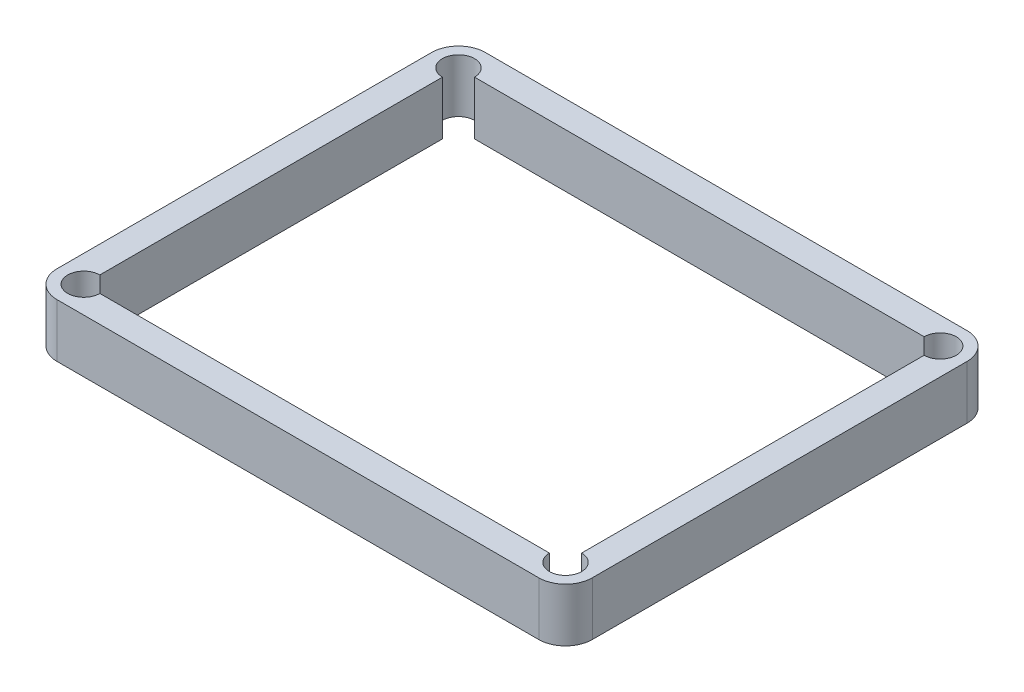
ISO-10303-21;
HEADER;
FILE_DESCRIPTION(('STEP AP214'),'2;1');
FILE_NAME('part.step','',(''),(''),'','','');
FILE_SCHEMA(('AUTOMOTIVE_DESIGN { 1 0 10303 214 1 1 1 1 }'));
ENDSEC;
DATA;
#1=APPLICATION_CONTEXT('core data for automotive mechanical design processes');
#2=APPLICATION_PROTOCOL_DEFINITION('international standard','automotive_design',2000,#1);
#3=PRODUCT_CONTEXT('',#1,'mechanical');
#4=PRODUCT('Part','Part','',(#3));
#5=PRODUCT_RELATED_PRODUCT_CATEGORY('part','',(#4));
#6=PRODUCT_DEFINITION_FORMATION('','',#4);
#7=PRODUCT_DEFINITION_CONTEXT('part definition',#1,'design');
#8=PRODUCT_DEFINITION('design','',#6,#7);
#9=PRODUCT_DEFINITION_SHAPE('','',#8);
#10=(LENGTH_UNIT() NAMED_UNIT(*) SI_UNIT(.MILLI.,.METRE.));
#11=(NAMED_UNIT(*) PLANE_ANGLE_UNIT() SI_UNIT($,.RADIAN.));
#12=(NAMED_UNIT(*) SI_UNIT($,.STERADIAN.) SOLID_ANGLE_UNIT());
#13=UNCERTAINTY_MEASURE_WITH_UNIT(LENGTH_MEASURE(1.E-05),#10,'distance_accuracy_value','');
#14=(GEOMETRIC_REPRESENTATION_CONTEXT(3) GLOBAL_UNCERTAINTY_ASSIGNED_CONTEXT((#13)) GLOBAL_UNIT_ASSIGNED_CONTEXT((#10,
#11,#12)) REPRESENTATION_CONTEXT('',''));
#15=CARTESIAN_POINT('',(0.,0.,0.));
#16=DIRECTION('',(0.,0.,1.));
#17=DIRECTION('',(1.,0.,0.));
#18=AXIS2_PLACEMENT_3D('',#15,#16,#17);
#19=CARTESIAN_POINT('',(-55.2139943562877,5.,-17.0443805869234));
#20=DIRECTION('',(0.,-1.,0.));
#21=DIRECTION('',(0.,0.,-1.));
#22=AXIS2_PLACEMENT_3D('',#19,#20,#21);
#23=CYLINDRICAL_SURFACE('',#22,2.5);
#24=CARTESIAN_POINT('',(-55.2139943562877,0.,-17.0443805869234));
#25=DIRECTION('',(0.,1.,0.));
#26=DIRECTION('',(0.,0.,1.));
#27=AXIS2_PLACEMENT_3D('',#24,#25,#26);
#28=CIRCLE('',#27,2.5);
#29=CARTESIAN_POINT('',(-55.2139943562877,0.,-19.5443805869234));
#30=VERTEX_POINT('',#29);
#31=CARTESIAN_POINT('',(-57.7139943562877,0.,-17.0443805869234));
#32=VERTEX_POINT('',#31);
#33=EDGE_CURVE('E168',#30,#32,#28,.T.);
#34=ORIENTED_EDGE('',*,*,#33,.T.);
#35=DIRECTION('',(0.,-1.,0.));
#36=VECTOR('',#35,1.);
#37=CARTESIAN_POINT('',(-57.7139943562877,5.,-17.0443805869234));
#38=LINE('',#37,#36);
#39=CARTESIAN_POINT('',(-57.7139943562877,5.,-17.0443805869234));
#40=VERTEX_POINT('',#39);
#41=EDGE_CURVE('E229',#40,#32,#38,.T.);
#42=ORIENTED_EDGE('',*,*,#41,.F.);
#43=CARTESIAN_POINT('',(-55.2139943562877,5.,-17.0443805869234));
#44=DIRECTION('',(0.,1.,0.));
#45=DIRECTION('',(0.,0.,1.));
#46=AXIS2_PLACEMENT_3D('',#43,#44,#45);
#47=CIRCLE('',#46,2.5);
#48=CARTESIAN_POINT('',(-55.2139943562877,5.,-19.5443805869234));
#49=VERTEX_POINT('',#48);
#50=EDGE_CURVE('E175',#49,#40,#47,.T.);
#51=ORIENTED_EDGE('',*,*,#50,.F.);
#52=DIRECTION('',(0.,-1.,0.));
#53=VECTOR('',#52,1.);
#54=CARTESIAN_POINT('',(-55.2139943562877,5.,-19.5443805869234));
#55=LINE('',#54,#53);
#56=EDGE_CURVE('E193',#49,#30,#55,.T.);
#57=ORIENTED_EDGE('',*,*,#56,.T.);
#58=EDGE_LOOP('',(#34,#42,#51,#57));
#59=FACE_BOUND('',#58,.T.);
#60=ADVANCED_FACE('F31',(#59),#23,.T.);
#61=CARTESIAN_POINT('',(-57.7139943562877,5.,-17.0443805869234));
#62=DIRECTION('',(1.,0.,0.));
#63=DIRECTION('',(0.,0.,-1.));
#64=AXIS2_PLACEMENT_3D('',#61,#62,#63);
#65=PLANE('',#64);
#66=DIRECTION('',(0.,0.,1.));
#67=VECTOR('',#66,1.);
#68=CARTESIAN_POINT('',(-57.7139943562877,0.,-17.0443805869234));
#69=LINE('',#68,#67);
#70=CARTESIAN_POINT('',(-57.7139943562877,0.,17.9556194130766));
#71=VERTEX_POINT('',#70);
#72=EDGE_CURVE('E196',#32,#71,#69,.T.);
#73=ORIENTED_EDGE('',*,*,#72,.T.);
#74=DIRECTION('',(0.,-1.,0.));
#75=VECTOR('',#74,1.);
#76=CARTESIAN_POINT('',(-57.7139943562877,5.,17.9556194130766));
#77=LINE('',#76,#75);
#78=CARTESIAN_POINT('',(-57.7139943562877,5.,17.9556194130766));
#79=VERTEX_POINT('',#78);
#80=EDGE_CURVE('E226',#79,#71,#77,.T.);
#81=ORIENTED_EDGE('',*,*,#80,.F.);
#82=DIRECTION('',(0.,0.,1.));
#83=VECTOR('',#82,1.);
#84=CARTESIAN_POINT('',(-57.7139943562877,5.,-17.0443805869234));
#85=LINE('',#84,#83);
#86=EDGE_CURVE('E178',#40,#79,#85,.T.);
#87=ORIENTED_EDGE('',*,*,#86,.F.);
#88=ORIENTED_EDGE('',*,*,#41,.T.);
#89=EDGE_LOOP('',(#73,#81,#87,#88));
#90=FACE_BOUND('',#89,.T.);
#91=ADVANCED_FACE('F297',(#90),#65,.F.);
#92=CARTESIAN_POINT('',(-55.2139943562877,5.,17.9556194130766));
#93=DIRECTION('',(0.,-1.,0.));
#94=DIRECTION('',(0.,0.,-1.));
#95=AXIS2_PLACEMENT_3D('',#92,#93,#94);
#96=CYLINDRICAL_SURFACE('',#95,2.5);
#97=CARTESIAN_POINT('',(-55.2139943562877,0.,17.9556194130766));
#98=DIRECTION('',(0.,1.,0.));
#99=DIRECTION('',(0.,0.,1.));
#100=AXIS2_PLACEMENT_3D('',#97,#98,#99);
#101=CIRCLE('',#100,2.5);
#102=CARTESIAN_POINT('',(-55.2139943562877,0.,20.4556194130766));
#103=VERTEX_POINT('',#102);
#104=EDGE_CURVE('E198',#71,#103,#101,.T.);
#105=ORIENTED_EDGE('',*,*,#104,.T.);
#106=DIRECTION('',(0.,-1.,0.));
#107=VECTOR('',#106,1.);
#108=CARTESIAN_POINT('',(-55.2139943562877,5.,20.4556194130766));
#109=LINE('',#108,#107);
#110=CARTESIAN_POINT('',(-55.2139943562877,5.,20.4556194130766));
#111=VERTEX_POINT('',#110);
#112=EDGE_CURVE('E223',#111,#103,#109,.T.);
#113=ORIENTED_EDGE('',*,*,#112,.F.);
#114=CARTESIAN_POINT('',(-55.2139943562877,5.,17.9556194130766));
#115=DIRECTION('',(0.,1.,0.));
#116=DIRECTION('',(0.,0.,1.));
#117=AXIS2_PLACEMENT_3D('',#114,#115,#116);
#118=CIRCLE('',#117,2.5);
#119=EDGE_CURVE('E181',#79,#111,#118,.T.);
#120=ORIENTED_EDGE('',*,*,#119,.F.);
#121=ORIENTED_EDGE('',*,*,#80,.T.);
#122=EDGE_LOOP('',(#105,#113,#120,#121));
#123=FACE_BOUND('',#122,.T.);
#124=ADVANCED_FACE('F302',(#123),#96,.T.);
#125=CARTESIAN_POINT('',(-55.2139943562877,5.,20.4556194130766));
#126=DIRECTION('',(0.,0.,-1.));
#127=DIRECTION('',(-1.,0.,0.));
#128=AXIS2_PLACEMENT_3D('',#125,#126,#127);
#129=PLANE('',#128);
#130=DIRECTION('',(1.,0.,0.));
#131=VECTOR('',#130,1.);
#132=CARTESIAN_POINT('',(-55.2139943562877,0.,20.4556194130766));
#133=LINE('',#132,#131);
#134=CARTESIAN_POINT('',(-10.2139943562877,0.,20.4556194130766));
#135=VERTEX_POINT('',#134);
#136=EDGE_CURVE('E200',#103,#135,#133,.T.);
#137=ORIENTED_EDGE('',*,*,#136,.T.);
#138=DIRECTION('',(0.,-1.,0.));
#139=VECTOR('',#138,1.);
#140=CARTESIAN_POINT('',(-10.2139943562877,5.,20.4556194130766));
#141=LINE('',#140,#139);
#142=CARTESIAN_POINT('',(-10.2139943562877,5.,20.4556194130766));
#143=VERTEX_POINT('',#142);
#144=EDGE_CURVE('E220',#143,#135,#141,.T.);
#145=ORIENTED_EDGE('',*,*,#144,.F.);
#146=DIRECTION('',(1.,0.,0.));
#147=VECTOR('',#146,1.);
#148=CARTESIAN_POINT('',(-55.2139943562877,5.,20.4556194130766));
#149=LINE('',#148,#147);
#150=EDGE_CURVE('E183',#111,#143,#149,.T.);
#151=ORIENTED_EDGE('',*,*,#150,.F.);
#152=ORIENTED_EDGE('',*,*,#112,.T.);
#153=EDGE_LOOP('',(#137,#145,#151,#152));
#154=FACE_BOUND('',#153,.T.);
#155=ADVANCED_FACE('F334',(#154),#129,.F.);
#156=CARTESIAN_POINT('',(-10.2139943562877,5.,17.9556194130766));
#157=DIRECTION('',(0.,-1.,0.));
#158=DIRECTION('',(0.,0.,-1.));
#159=AXIS2_PLACEMENT_3D('',#156,#157,#158);
#160=CYLINDRICAL_SURFACE('',#159,2.5);
#161=CARTESIAN_POINT('',(-10.2139943562877,0.,17.9556194130766));
#162=DIRECTION('',(0.,1.,0.));
#163=DIRECTION('',(0.,0.,1.));
#164=AXIS2_PLACEMENT_3D('',#161,#162,#163);
#165=CIRCLE('',#164,2.5);
#166=CARTESIAN_POINT('',(-7.71399435628767,0.,17.9556194130766));
#167=VERTEX_POINT('',#166);
#168=EDGE_CURVE('E202',#135,#167,#165,.T.);
#169=ORIENTED_EDGE('',*,*,#168,.T.);
#170=DIRECTION('',(0.,-1.,0.));
#171=VECTOR('',#170,1.);
#172=CARTESIAN_POINT('',(-7.71399435628767,5.,17.9556194130766));
#173=LINE('',#172,#171);
#174=CARTESIAN_POINT('',(-7.71399435628767,5.,17.9556194130766));
#175=VERTEX_POINT('',#174);
#176=EDGE_CURVE('E217',#175,#167,#173,.T.);
#177=ORIENTED_EDGE('',*,*,#176,.F.);
#178=CARTESIAN_POINT('',(-10.2139943562877,5.,17.9556194130766));
#179=DIRECTION('',(0.,1.,0.));
#180=DIRECTION('',(0.,0.,1.));
#181=AXIS2_PLACEMENT_3D('',#178,#179,#180);
#182=CIRCLE('',#181,2.5);
#183=EDGE_CURVE('E185',#143,#175,#182,.T.);
#184=ORIENTED_EDGE('',*,*,#183,.F.);
#185=ORIENTED_EDGE('',*,*,#144,.T.);
#186=EDGE_LOOP('',(#169,#177,#184,#185));
#187=FACE_BOUND('',#186,.T.);
#188=ADVANCED_FACE('F330',(#187),#160,.T.);
#189=CARTESIAN_POINT('',(-7.71399435628767,5.,-17.0443805869234));
#190=DIRECTION('',(-1.,0.,0.));
#191=DIRECTION('',(0.,0.,1.));
#192=AXIS2_PLACEMENT_3D('',#189,#190,#191);
#193=PLANE('',#192);
#194=DIRECTION('',(0.,0.,-1.));
#195=VECTOR('',#194,1.);
#196=CARTESIAN_POINT('',(-7.71399435628767,0.,-17.0443805869234));
#197=LINE('',#196,#195);
#198=CARTESIAN_POINT('',(-7.71399435628767,0.,-17.0443805869234));
#199=VERTEX_POINT('',#198);
#200=EDGE_CURVE('E204',#167,#199,#197,.T.);
#201=ORIENTED_EDGE('',*,*,#200,.T.);
#202=DIRECTION('',(0.,-1.,0.));
#203=VECTOR('',#202,1.);
#204=CARTESIAN_POINT('',(-7.71399435628767,5.,-17.0443805869234));
#205=LINE('',#204,#203);
#206=CARTESIAN_POINT('',(-7.71399435628767,5.,-17.0443805869234));
#207=VERTEX_POINT('',#206);
#208=EDGE_CURVE('E214',#207,#199,#205,.T.);
#209=ORIENTED_EDGE('',*,*,#208,.F.);
#210=DIRECTION('',(0.,0.,-1.));
#211=VECTOR('',#210,1.);
#212=CARTESIAN_POINT('',(-7.71399435628767,5.,-17.0443805869234));
#213=LINE('',#212,#211);
#214=EDGE_CURVE('E187',#175,#207,#213,.T.);
#215=ORIENTED_EDGE('',*,*,#214,.F.);
#216=ORIENTED_EDGE('',*,*,#176,.T.);
#217=EDGE_LOOP('',(#201,#209,#215,#216));
#218=FACE_BOUND('',#217,.T.);
#219=ADVANCED_FACE('F325',(#218),#193,.F.);
#220=CARTESIAN_POINT('',(-10.2139943562877,5.,-17.0443805869234));
#221=DIRECTION('',(0.,-1.,0.));
#222=DIRECTION('',(0.,0.,-1.));
#223=AXIS2_PLACEMENT_3D('',#220,#221,#222);
#224=CYLINDRICAL_SURFACE('',#223,2.5);
#225=CARTESIAN_POINT('',(-10.2139943562877,0.,-17.0443805869234));
#226=DIRECTION('',(0.,1.,0.));
#227=DIRECTION('',(0.,0.,1.));
#228=AXIS2_PLACEMENT_3D('',#225,#226,#227);
#229=CIRCLE('',#228,2.5);
#230=CARTESIAN_POINT('',(-10.2139943562877,0.,-19.5443805869234));
#231=VERTEX_POINT('',#230);
#232=EDGE_CURVE('E206',#199,#231,#229,.T.);
#233=ORIENTED_EDGE('',*,*,#232,.T.);
#234=DIRECTION('',(0.,-1.,0.));
#235=VECTOR('',#234,1.);
#236=CARTESIAN_POINT('',(-10.2139943562877,5.,-19.5443805869234));
#237=LINE('',#236,#235);
#238=CARTESIAN_POINT('',(-10.2139943562877,5.,-19.5443805869234));
#239=VERTEX_POINT('',#238);
#240=EDGE_CURVE('E211',#239,#231,#237,.T.);
#241=ORIENTED_EDGE('',*,*,#240,.F.);
#242=CARTESIAN_POINT('',(-10.2139943562877,5.,-17.0443805869234));
#243=DIRECTION('',(0.,1.,0.));
#244=DIRECTION('',(0.,0.,1.));
#245=AXIS2_PLACEMENT_3D('',#242,#243,#244);
#246=CIRCLE('',#245,2.5);
#247=EDGE_CURVE('E189',#207,#239,#246,.T.);
#248=ORIENTED_EDGE('',*,*,#247,.F.);
#249=ORIENTED_EDGE('',*,*,#208,.T.);
#250=EDGE_LOOP('',(#233,#241,#248,#249));
#251=FACE_BOUND('',#250,.T.);
#252=ADVANCED_FACE('F320',(#251),#224,.T.);
#253=CARTESIAN_POINT('',(-55.2139943562877,5.,-19.5443805869234));
#254=DIRECTION('',(0.,0.,1.));
#255=DIRECTION('',(1.,0.,0.));
#256=AXIS2_PLACEMENT_3D('',#253,#254,#255);
#257=PLANE('',#256);
#258=DIRECTION('',(-1.,0.,0.));
#259=VECTOR('',#258,1.);
#260=CARTESIAN_POINT('',(-55.2139943562877,0.,-19.5443805869234));
#261=LINE('',#260,#259);
#262=EDGE_CURVE('E179',#231,#30,#261,.T.);
#263=ORIENTED_EDGE('',*,*,#262,.T.);
#264=ORIENTED_EDGE('',*,*,#56,.F.);
#265=DIRECTION('',(-1.,0.,0.));
#266=VECTOR('',#265,1.);
#267=CARTESIAN_POINT('',(-55.2139943562877,5.,-19.5443805869234));
#268=LINE('',#267,#266);
#269=EDGE_CURVE('E191',#239,#49,#268,.T.);
#270=ORIENTED_EDGE('',*,*,#269,.F.);
#271=ORIENTED_EDGE('',*,*,#240,.T.);
#272=EDGE_LOOP('',(#263,#264,#270,#271));
#273=FACE_BOUND('',#272,.T.);
#274=ADVANCED_FACE('F318',(#273),#257,.F.);
#275=CARTESIAN_POINT('',(-55.2139943562877,5.,-17.0443805869234));
#276=DIRECTION('',(0.,1.,0.));
#277=DIRECTION('',(0.,0.,1.));
#278=AXIS2_PLACEMENT_3D('',#275,#276,#277);
#279=PLANE('',#278);
#280=DIRECTION('',(0.,0.,1.));
#281=VECTOR('',#280,1.);
#282=CARTESIAN_POINT('',(-55.2139943562876,5.,-17.0443805869234));
#283=LINE('',#282,#281);
#284=CARTESIAN_POINT('',(-55.2139943562876,5.,-15.5443805869234));
#285=VERTEX_POINT('',#284);
#286=CARTESIAN_POINT('',(-55.2139943562876,5.,16.4556194130766));
#287=VERTEX_POINT('',#286);
#288=EDGE_CURVE('E52',#285,#287,#283,.T.);
#289=ORIENTED_EDGE('',*,*,#288,.F.);
#290=CARTESIAN_POINT('',(-55.2139943562876,5.,-17.0443805869234));
#291=DIRECTION('',(0.,1.,0.));
#292=DIRECTION('',(0.,0.,1.));
#293=AXIS2_PLACEMENT_3D('',#290,#291,#292);
#294=CIRCLE('',#293,1.5);
#295=CARTESIAN_POINT('',(-53.7139943562876,5.,-17.0443805869234));
#296=VERTEX_POINT('',#295);
#297=EDGE_CURVE('E157',#296,#285,#294,.T.);
#298=ORIENTED_EDGE('',*,*,#297,.F.);
#299=DIRECTION('',(-1.,0.,0.));
#300=VECTOR('',#299,1.);
#301=CARTESIAN_POINT('',(-55.2139943562876,5.,-17.0443805869234));
#302=LINE('',#301,#300);
#303=CARTESIAN_POINT('',(-11.7139943562877,5.,-17.0443805869234));
#304=VERTEX_POINT('',#303);
#305=EDGE_CURVE('E248',#304,#296,#302,.T.);
#306=ORIENTED_EDGE('',*,*,#305,.F.);
#307=CARTESIAN_POINT('',(-10.2139943562877,5.,-17.0443805869234));
#308=DIRECTION('',(0.,1.,0.));
#309=DIRECTION('',(0.,0.,1.));
#310=AXIS2_PLACEMENT_3D('',#307,#308,#309);
#311=CIRCLE('',#310,1.5);
#312=CARTESIAN_POINT('',(-10.2139943562877,5.,-15.5443805869234));
#313=VERTEX_POINT('',#312);
#314=EDGE_CURVE('E171',#313,#304,#311,.T.);
#315=ORIENTED_EDGE('',*,*,#314,.F.);
#316=DIRECTION('',(0.,0.,-1.));
#317=VECTOR('',#316,1.);
#318=CARTESIAN_POINT('',(-10.2139943562877,5.,-17.0443805869234));
#319=LINE('',#318,#317);
#320=CARTESIAN_POINT('',(-10.2139943562877,5.,16.4556194130766));
#321=VERTEX_POINT('',#320);
#322=EDGE_CURVE('E252',#321,#313,#319,.T.);
#323=ORIENTED_EDGE('',*,*,#322,.F.);
#324=CARTESIAN_POINT('',(-10.2139943562877,5.,17.9556194130766));
#325=DIRECTION('',(0.,1.,0.));
#326=DIRECTION('',(0.,0.,1.));
#327=AXIS2_PLACEMENT_3D('',#324,#325,#326);
#328=CIRCLE('',#327,1.5);
#329=CARTESIAN_POINT('',(-11.7139943562877,5.,17.9556194130766));
#330=VERTEX_POINT('',#329);
#331=EDGE_CURVE('E265',#330,#321,#328,.T.);
#332=ORIENTED_EDGE('',*,*,#331,.F.);
#333=DIRECTION('',(1.,0.,0.));
#334=VECTOR('',#333,1.);
#335=CARTESIAN_POINT('',(-55.2139943562876,5.,17.9556194130766));
#336=LINE('',#335,#334);
#337=CARTESIAN_POINT('',(-53.7139943562876,5.,17.9556194130766));
#338=VERTEX_POINT('',#337);
#339=EDGE_CURVE('E161',#338,#330,#336,.T.);
#340=ORIENTED_EDGE('',*,*,#339,.F.);
#341=CARTESIAN_POINT('',(-55.2139943562876,5.,17.9556194130766));
#342=DIRECTION('',(0.,1.,0.));
#343=DIRECTION('',(0.,0.,1.));
#344=AXIS2_PLACEMENT_3D('',#341,#342,#343);
#345=CIRCLE('',#344,1.5);
#346=EDGE_CURVE('E160',#287,#338,#345,.T.);
#347=ORIENTED_EDGE('',*,*,#346,.F.);
#348=EDGE_LOOP('',(#289,#298,#306,#315,#323,#332,#340,#347));
#349=FACE_BOUND('',#348,.T.);
#350=ORIENTED_EDGE('',*,*,#50,.T.);
#351=ORIENTED_EDGE('',*,*,#86,.T.);
#352=ORIENTED_EDGE('',*,*,#119,.T.);
#353=ORIENTED_EDGE('',*,*,#150,.T.);
#354=ORIENTED_EDGE('',*,*,#183,.T.);
#355=ORIENTED_EDGE('',*,*,#214,.T.);
#356=ORIENTED_EDGE('',*,*,#247,.T.);
#357=ORIENTED_EDGE('',*,*,#269,.T.);
#358=EDGE_LOOP('',(#350,#351,#352,#353,#354,#355,#356,#357));
#359=FACE_BOUND('',#358,.T.);
#360=ADVANCED_FACE('F154',(#349,#359),#279,.T.);
#361=CARTESIAN_POINT('',(-55.2139943562877,0.,-17.0443805869234));
#362=DIRECTION('',(0.,1.,0.));
#363=DIRECTION('',(0.,0.,1.));
#364=AXIS2_PLACEMENT_3D('',#361,#362,#363);
#365=PLANE('',#364);
#366=CARTESIAN_POINT('',(-55.2139943562876,0.,-17.0443805869234));
#367=DIRECTION('',(0.,1.,0.));
#368=DIRECTION('',(0.,0.,1.));
#369=AXIS2_PLACEMENT_3D('',#366,#367,#368);
#370=CIRCLE('',#369,1.5);
#371=CARTESIAN_POINT('',(-53.7139943562876,0.,-17.0443805869234));
#372=VERTEX_POINT('',#371);
#373=CARTESIAN_POINT('',(-55.2139943562876,0.,-15.5443805869234));
#374=VERTEX_POINT('',#373);
#375=EDGE_CURVE('E165',#372,#374,#370,.T.);
#376=ORIENTED_EDGE('',*,*,#375,.T.);
#377=DIRECTION('',(0.,0.,1.));
#378=VECTOR('',#377,1.);
#379=CARTESIAN_POINT('',(-55.2139943562876,0.,-17.0443805869234));
#380=LINE('',#379,#378);
#381=CARTESIAN_POINT('',(-55.2139943562876,0.,16.4556194130766));
#382=VERTEX_POINT('',#381);
#383=EDGE_CURVE('E143',#374,#382,#380,.T.);
#384=ORIENTED_EDGE('',*,*,#383,.T.);
#385=CARTESIAN_POINT('',(-55.2139943562876,0.,17.9556194130766));
#386=DIRECTION('',(0.,1.,0.));
#387=DIRECTION('',(0.,0.,1.));
#388=AXIS2_PLACEMENT_3D('',#385,#386,#387);
#389=CIRCLE('',#388,1.5);
#390=CARTESIAN_POINT('',(-53.7139943562876,0.,17.9556194130766));
#391=VERTEX_POINT('',#390);
#392=EDGE_CURVE('E242',#382,#391,#389,.T.);
#393=ORIENTED_EDGE('',*,*,#392,.T.);
#394=DIRECTION('',(1.,0.,0.));
#395=VECTOR('',#394,1.);
#396=CARTESIAN_POINT('',(-55.2139943562876,0.,17.9556194130766));
#397=LINE('',#396,#395);
#398=CARTESIAN_POINT('',(-11.7139943562877,0.,17.9556194130766));
#399=VERTEX_POINT('',#398);
#400=EDGE_CURVE('E247',#391,#399,#397,.T.);
#401=ORIENTED_EDGE('',*,*,#400,.T.);
#402=CARTESIAN_POINT('',(-10.2139943562877,0.,17.9556194130766));
#403=DIRECTION('',(0.,1.,0.));
#404=DIRECTION('',(0.,0.,1.));
#405=AXIS2_PLACEMENT_3D('',#402,#403,#404);
#406=CIRCLE('',#405,1.5);
#407=CARTESIAN_POINT('',(-10.2139943562877,0.,16.4556194130766));
#408=VERTEX_POINT('',#407);
#409=EDGE_CURVE('E266',#399,#408,#406,.T.);
#410=ORIENTED_EDGE('',*,*,#409,.T.);
#411=DIRECTION('',(0.,0.,-1.));
#412=VECTOR('',#411,1.);
#413=CARTESIAN_POINT('',(-10.2139943562877,0.,-17.0443805869234));
#414=LINE('',#413,#412);
#415=CARTESIAN_POINT('',(-10.2139943562877,0.,-15.5443805869234));
#416=VERTEX_POINT('',#415);
#417=EDGE_CURVE('E250',#408,#416,#414,.T.);
#418=ORIENTED_EDGE('',*,*,#417,.T.);
#419=CARTESIAN_POINT('',(-10.2139943562877,0.,-17.0443805869234));
#420=DIRECTION('',(0.,1.,0.));
#421=DIRECTION('',(0.,0.,1.));
#422=AXIS2_PLACEMENT_3D('',#419,#420,#421);
#423=CIRCLE('',#422,1.5);
#424=CARTESIAN_POINT('',(-11.7139943562877,0.,-17.0443805869234));
#425=VERTEX_POINT('',#424);
#426=EDGE_CURVE('E166',#416,#425,#423,.T.);
#427=ORIENTED_EDGE('',*,*,#426,.T.);
#428=DIRECTION('',(-1.,0.,0.));
#429=VECTOR('',#428,1.);
#430=CARTESIAN_POINT('',(-55.2139943562876,0.,-17.0443805869234));
#431=LINE('',#430,#429);
#432=EDGE_CURVE('E45',#425,#372,#431,.T.);
#433=ORIENTED_EDGE('',*,*,#432,.T.);
#434=EDGE_LOOP('',(#376,#384,#393,#401,#410,#418,#427,#433));
#435=FACE_BOUND('',#434,.T.);
#436=ORIENTED_EDGE('',*,*,#33,.F.);
#437=ORIENTED_EDGE('',*,*,#262,.F.);
#438=ORIENTED_EDGE('',*,*,#232,.F.);
#439=ORIENTED_EDGE('',*,*,#200,.F.);
#440=ORIENTED_EDGE('',*,*,#168,.F.);
#441=ORIENTED_EDGE('',*,*,#136,.F.);
#442=ORIENTED_EDGE('',*,*,#104,.F.);
#443=ORIENTED_EDGE('',*,*,#72,.F.);
#444=EDGE_LOOP('',(#436,#437,#438,#439,#440,#441,#442,#443));
#445=FACE_BOUND('',#444,.T.);
#446=ADVANCED_FACE('F244',(#435,#445),#365,.F.);
#447=CARTESIAN_POINT('',(-55.2139943562876,0.,-17.0443805869234));
#448=DIRECTION('',(0.,1.,0.));
#449=DIRECTION('',(0.,0.,1.));
#450=AXIS2_PLACEMENT_3D('',#447,#448,#449);
#451=CYLINDRICAL_SURFACE('',#450,1.5);
#452=ORIENTED_EDGE('',*,*,#297,.T.);
#453=DIRECTION('',(0.,1.,0.));
#454=VECTOR('',#453,1.);
#455=CARTESIAN_POINT('',(-55.2139943562876,0.,-15.5443805869234));
#456=LINE('',#455,#454);
#457=EDGE_CURVE('E140',#285,#374,#456,.F.);
#458=ORIENTED_EDGE('',*,*,#457,.T.);
#459=ORIENTED_EDGE('',*,*,#375,.F.);
#460=DIRECTION('',(0.,1.,0.));
#461=VECTOR('',#460,1.);
#462=CARTESIAN_POINT('',(-53.7139943562876,0.,-17.0443805869234));
#463=LINE('',#462,#461);
#464=EDGE_CURVE('E148',#372,#296,#463,.T.);
#465=ORIENTED_EDGE('',*,*,#464,.T.);
#466=EDGE_LOOP('',(#452,#458,#459,#465));
#467=FACE_BOUND('',#466,.T.);
#468=ADVANCED_FACE('F164',(#467),#451,.F.);
#469=CARTESIAN_POINT('',(-10.2139943562877,0.,-17.0443805869234));
#470=DIRECTION('',(0.,1.,0.));
#471=DIRECTION('',(0.,0.,1.));
#472=AXIS2_PLACEMENT_3D('',#469,#470,#471);
#473=CYLINDRICAL_SURFACE('',#472,1.5);
#474=ORIENTED_EDGE('',*,*,#314,.T.);
#475=DIRECTION('',(0.,1.,0.));
#476=VECTOR('',#475,1.);
#477=CARTESIAN_POINT('',(-11.7139943562877,0.,-17.0443805869234));
#478=LINE('',#477,#476);
#479=EDGE_CURVE('E11',#304,#425,#478,.F.);
#480=ORIENTED_EDGE('',*,*,#479,.T.);
#481=ORIENTED_EDGE('',*,*,#426,.F.);
#482=DIRECTION('',(0.,1.,0.));
#483=VECTOR('',#482,1.);
#484=CARTESIAN_POINT('',(-10.2139943562877,0.,-15.5443805869234));
#485=LINE('',#484,#483);
#486=EDGE_CURVE('E149',#416,#313,#485,.T.);
#487=ORIENTED_EDGE('',*,*,#486,.T.);
#488=EDGE_LOOP('',(#474,#480,#481,#487));
#489=FACE_BOUND('',#488,.T.);
#490=ADVANCED_FACE('F275',(#489),#473,.F.);
#491=CARTESIAN_POINT('',(-55.2139943562876,0.,17.9556194130766));
#492=DIRECTION('',(0.,1.,0.));
#493=DIRECTION('',(0.,0.,1.));
#494=AXIS2_PLACEMENT_3D('',#491,#492,#493);
#495=CYLINDRICAL_SURFACE('',#494,1.5);
#496=ORIENTED_EDGE('',*,*,#392,.F.);
#497=DIRECTION('',(0.,1.,0.));
#498=VECTOR('',#497,1.);
#499=CARTESIAN_POINT('',(-55.2139943562876,0.,16.4556194130766));
#500=LINE('',#499,#498);
#501=EDGE_CURVE('E38',#382,#287,#500,.T.);
#502=ORIENTED_EDGE('',*,*,#501,.T.);
#503=ORIENTED_EDGE('',*,*,#346,.T.);
#504=DIRECTION('',(0.,1.,0.));
#505=VECTOR('',#504,1.);
#506=CARTESIAN_POINT('',(-53.7139943562876,0.,17.9556194130766));
#507=LINE('',#506,#505);
#508=EDGE_CURVE('E257',#338,#391,#507,.F.);
#509=ORIENTED_EDGE('',*,*,#508,.T.);
#510=EDGE_LOOP('',(#496,#502,#503,#509));
#511=FACE_BOUND('',#510,.T.);
#512=ADVANCED_FACE('F239',(#511),#495,.F.);
#513=CARTESIAN_POINT('',(-10.2139943562877,0.,17.9556194130766));
#514=DIRECTION('',(0.,1.,0.));
#515=DIRECTION('',(0.,0.,1.));
#516=AXIS2_PLACEMENT_3D('',#513,#514,#515);
#517=CYLINDRICAL_SURFACE('',#516,1.5);
#518=ORIENTED_EDGE('',*,*,#331,.T.);
#519=DIRECTION('',(0.,1.,0.));
#520=VECTOR('',#519,1.);
#521=CARTESIAN_POINT('',(-10.2139943562877,0.,16.4556194130766));
#522=LINE('',#521,#520);
#523=EDGE_CURVE('E235',#321,#408,#522,.F.);
#524=ORIENTED_EDGE('',*,*,#523,.T.);
#525=ORIENTED_EDGE('',*,*,#409,.F.);
#526=DIRECTION('',(0.,1.,0.));
#527=VECTOR('',#526,1.);
#528=CARTESIAN_POINT('',(-11.7139943562877,0.,17.9556194130766));
#529=LINE('',#528,#527);
#530=EDGE_CURVE('E232',#399,#330,#529,.T.);
#531=ORIENTED_EDGE('',*,*,#530,.T.);
#532=EDGE_LOOP('',(#518,#524,#525,#531));
#533=FACE_BOUND('',#532,.T.);
#534=ADVANCED_FACE('F284',(#533),#517,.F.);
#535=CARTESIAN_POINT('',(-55.2139943562876,0.,17.9556194130766));
#536=DIRECTION('',(0.,0.,1.));
#537=DIRECTION('',(1.,0.,0.));
#538=AXIS2_PLACEMENT_3D('',#535,#536,#537);
#539=PLANE('',#538);
#540=ORIENTED_EDGE('',*,*,#339,.T.);
#541=ORIENTED_EDGE('',*,*,#530,.F.);
#542=ORIENTED_EDGE('',*,*,#400,.F.);
#543=ORIENTED_EDGE('',*,*,#508,.F.);
#544=EDGE_LOOP('',(#540,#541,#542,#543));
#545=FACE_BOUND('',#544,.T.);
#546=ADVANCED_FACE('F286',(#545),#539,.F.);
#547=CARTESIAN_POINT('',(-10.2139943562877,0.,-17.0443805869234));
#548=DIRECTION('',(1.,0.,0.));
#549=DIRECTION('',(0.,0.,-1.));
#550=AXIS2_PLACEMENT_3D('',#547,#548,#549);
#551=PLANE('',#550);
#552=ORIENTED_EDGE('',*,*,#417,.F.);
#553=ORIENTED_EDGE('',*,*,#523,.F.);
#554=ORIENTED_EDGE('',*,*,#322,.T.);
#555=ORIENTED_EDGE('',*,*,#486,.F.);
#556=EDGE_LOOP('',(#552,#553,#554,#555));
#557=FACE_BOUND('',#556,.T.);
#558=ADVANCED_FACE('F282',(#557),#551,.F.);
#559=CARTESIAN_POINT('',(-55.2139943562876,0.,-17.0443805869234));
#560=DIRECTION('',(-1.,0.,0.));
#561=DIRECTION('',(0.,0.,1.));
#562=AXIS2_PLACEMENT_3D('',#559,#560,#561);
#563=PLANE('',#562);
#564=ORIENTED_EDGE('',*,*,#288,.T.);
#565=ORIENTED_EDGE('',*,*,#501,.F.);
#566=ORIENTED_EDGE('',*,*,#383,.F.);
#567=ORIENTED_EDGE('',*,*,#457,.F.);
#568=EDGE_LOOP('',(#564,#565,#566,#567));
#569=FACE_BOUND('',#568,.T.);
#570=ADVANCED_FACE('F141',(#569),#563,.F.);
#571=CARTESIAN_POINT('',(-55.2139943562876,0.,-17.0443805869234));
#572=DIRECTION('',(0.,0.,-1.));
#573=DIRECTION('',(-1.,0.,0.));
#574=AXIS2_PLACEMENT_3D('',#571,#572,#573);
#575=PLANE('',#574);
#576=ORIENTED_EDGE('',*,*,#432,.F.);
#577=ORIENTED_EDGE('',*,*,#479,.F.);
#578=ORIENTED_EDGE('',*,*,#305,.T.);
#579=ORIENTED_EDGE('',*,*,#464,.F.);
#580=EDGE_LOOP('',(#576,#577,#578,#579));
#581=FACE_BOUND('',#580,.T.);
#582=ADVANCED_FACE('F279',(#581),#575,.F.);
#583=CLOSED_SHELL('',(#60,#91,#124,#155,#188,#219,#252,#274,#360,#446,#468,#490,#512,#534,#546,
#558,#570,#582));
#584=MANIFOLD_SOLID_BREP('B2',#583);
#585=ADVANCED_BREP_SHAPE_REPRESENTATION('',(#18,#584),#14);
#586=SHAPE_DEFINITION_REPRESENTATION(#9,#585);
ENDSEC;
END-ISO-10303-21;
